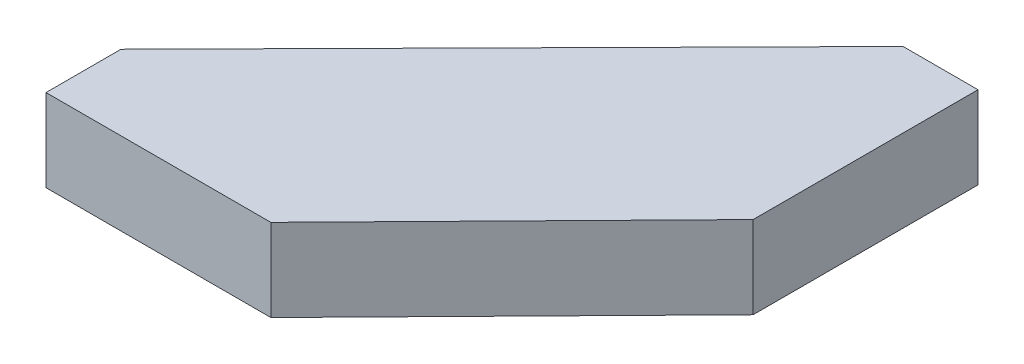
ISO-10303-21;
HEADER;
FILE_DESCRIPTION(('STEP AP214'),'2;1');
FILE_NAME('part.step','',(''),(''),'','','');
FILE_SCHEMA(('AUTOMOTIVE_DESIGN { 1 0 10303 214 1 1 1 1 }'));
ENDSEC;
DATA;
#1=APPLICATION_CONTEXT('core data for automotive mechanical design processes');
#2=APPLICATION_PROTOCOL_DEFINITION('international standard','automotive_design',2000,#1);
#3=PRODUCT_CONTEXT('',#1,'mechanical');
#4=PRODUCT('Part','Part','',(#3));
#5=PRODUCT_RELATED_PRODUCT_CATEGORY('part','',(#4));
#6=PRODUCT_DEFINITION_FORMATION('','',#4);
#7=PRODUCT_DEFINITION_CONTEXT('part definition',#1,'design');
#8=PRODUCT_DEFINITION('design','',#6,#7);
#9=PRODUCT_DEFINITION_SHAPE('','',#8);
#10=(LENGTH_UNIT() NAMED_UNIT(*) SI_UNIT(.MILLI.,.METRE.));
#11=(NAMED_UNIT(*) PLANE_ANGLE_UNIT() SI_UNIT($,.RADIAN.));
#12=(NAMED_UNIT(*) SI_UNIT($,.STERADIAN.) SOLID_ANGLE_UNIT());
#13=UNCERTAINTY_MEASURE_WITH_UNIT(LENGTH_MEASURE(1.E-05),#10,'distance_accuracy_value','');
#14=(GEOMETRIC_REPRESENTATION_CONTEXT(3) GLOBAL_UNCERTAINTY_ASSIGNED_CONTEXT((#13)) GLOBAL_UNIT_ASSIGNED_CONTEXT((#10,
#11,#12)) REPRESENTATION_CONTEXT('',''));
#15=CARTESIAN_POINT('',(0.,0.,0.));
#16=DIRECTION('',(0.,0.,1.));
#17=DIRECTION('',(1.,0.,0.));
#18=AXIS2_PLACEMENT_3D('',#15,#16,#17);
#19=CARTESIAN_POINT('',(-15.4006334841629,4.4,10.3031674208145));
#20=DIRECTION('',(1.,0.,0.));
#21=DIRECTION('',(0.,0.,-1.));
#22=AXIS2_PLACEMENT_3D('',#19,#20,#21);
#23=PLANE('',#22);
#24=DIRECTION('',(0.,0.,1.));
#25=VECTOR('',#24,1.);
#26=CARTESIAN_POINT('',(-15.4006334841629,0.,10.3031674208145));
#27=LINE('',#26,#25);
#28=CARTESIAN_POINT('',(-15.4006334841629,0.,10.3031674208145));
#29=VERTEX_POINT('',#28);
#30=CARTESIAN_POINT('',(-15.4006334841629,0.,14.3031674208145));
#31=VERTEX_POINT('',#30);
#32=EDGE_CURVE('E121',#29,#31,#27,.T.);
#33=ORIENTED_EDGE('',*,*,#32,.T.);
#34=DIRECTION('',(0.,-1.,0.));
#35=VECTOR('',#34,1.);
#36=CARTESIAN_POINT('',(-15.4006334841629,4.4,14.3031674208145));
#37=LINE('',#36,#35);
#38=CARTESIAN_POINT('',(-15.4006334841629,4.4,14.3031674208145));
#39=VERTEX_POINT('',#38);
#40=EDGE_CURVE('E11',#39,#31,#37,.T.);
#41=ORIENTED_EDGE('',*,*,#40,.F.);
#42=DIRECTION('',(0.,0.,1.));
#43=VECTOR('',#42,1.);
#44=CARTESIAN_POINT('',(-15.4006334841629,4.4,10.3031674208145));
#45=LINE('',#44,#43);
#46=CARTESIAN_POINT('',(-15.4006334841629,4.4,10.3031674208145));
#47=VERTEX_POINT('',#46);
#48=EDGE_CURVE('E131',#47,#39,#45,.T.);
#49=ORIENTED_EDGE('',*,*,#48,.F.);
#50=DIRECTION('',(0.,-1.,0.));
#51=VECTOR('',#50,1.);
#52=CARTESIAN_POINT('',(-15.4006334841629,4.4,10.3031674208145));
#53=LINE('',#52,#51);
#54=EDGE_CURVE('E117',#47,#29,#53,.T.);
#55=ORIENTED_EDGE('',*,*,#54,.T.);
#56=EDGE_LOOP('',(#33,#41,#49,#55));
#57=FACE_BOUND('',#56,.T.);
#58=ADVANCED_FACE('F37',(#57),#23,.F.);
#59=CARTESIAN_POINT('',(-15.4006334841629,4.4,14.3031674208145));
#60=DIRECTION('',(0.,0.,-1.));
#61=DIRECTION('',(-1.,0.,0.));
#62=AXIS2_PLACEMENT_3D('',#59,#60,#61);
#63=PLANE('',#62);
#64=DIRECTION('',(1.,0.,0.));
#65=VECTOR('',#64,1.);
#66=CARTESIAN_POINT('',(-15.4006334841629,0.,14.3031674208145));
#67=LINE('',#66,#65);
#68=CARTESIAN_POINT('',(-3.40063348416288,0.,14.3031674208145));
#69=VERTEX_POINT('',#68);
#70=EDGE_CURVE('E124',#31,#69,#67,.T.);
#71=ORIENTED_EDGE('',*,*,#70,.T.);
#72=DIRECTION('',(0.,-1.,0.));
#73=VECTOR('',#72,1.);
#74=CARTESIAN_POINT('',(-3.40063348416288,4.4,14.3031674208145));
#75=LINE('',#74,#73);
#76=CARTESIAN_POINT('',(-3.40063348416288,4.4,14.3031674208145));
#77=VERTEX_POINT('',#76);
#78=EDGE_CURVE('E45',#77,#69,#75,.T.);
#79=ORIENTED_EDGE('',*,*,#78,.F.);
#80=DIRECTION('',(1.,0.,0.));
#81=VECTOR('',#80,1.);
#82=CARTESIAN_POINT('',(-15.4006334841629,4.4,14.3031674208145));
#83=LINE('',#82,#81);
#84=EDGE_CURVE('E90',#39,#77,#83,.T.);
#85=ORIENTED_EDGE('',*,*,#84,.F.);
#86=ORIENTED_EDGE('',*,*,#40,.T.);
#87=EDGE_LOOP('',(#71,#79,#85,#86));
#88=FACE_BOUND('',#87,.T.);
#89=ADVANCED_FACE('F155',(#88),#63,.F.);
#90=CARTESIAN_POINT('',(-3.40063348416288,4.4,14.3031674208145));
#91=DIRECTION('',(-0.714212839142508,0.,-0.699928582359656));
#92=DIRECTION('',(-0.699928582359656,0.,0.714212839142508));
#93=AXIS2_PLACEMENT_3D('',#90,#91,#92);
#94=PLANE('',#93);
#95=DIRECTION('',(0.699928582359656,0.,-0.714212839142508));
#96=VECTOR('',#95,1.);
#97=CARTESIAN_POINT('',(-3.40063348416288,0.,14.3031674208145));
#98=LINE('',#97,#96);
#99=CARTESIAN_POINT('',(9.33936651583711,0.,1.30316742081447));
#100=VERTEX_POINT('',#99);
#101=EDGE_CURVE('E126',#69,#100,#98,.T.);
#102=ORIENTED_EDGE('',*,*,#101,.T.);
#103=DIRECTION('',(0.,-1.,0.));
#104=VECTOR('',#103,1.);
#105=CARTESIAN_POINT('',(9.33936651583711,4.4,1.30316742081447));
#106=LINE('',#105,#104);
#107=CARTESIAN_POINT('',(9.33936651583711,4.4,1.30316742081447));
#108=VERTEX_POINT('',#107);
#109=EDGE_CURVE('E112',#108,#100,#106,.T.);
#110=ORIENTED_EDGE('',*,*,#109,.F.);
#111=DIRECTION('',(0.699928582359656,0.,-0.714212839142508));
#112=VECTOR('',#111,1.);
#113=CARTESIAN_POINT('',(-3.40063348416288,4.4,14.3031674208145));
#114=LINE('',#113,#112);
#115=EDGE_CURVE('E103',#77,#108,#114,.T.);
#116=ORIENTED_EDGE('',*,*,#115,.F.);
#117=ORIENTED_EDGE('',*,*,#78,.T.);
#118=EDGE_LOOP('',(#102,#110,#116,#117));
#119=FACE_BOUND('',#118,.T.);
#120=ADVANCED_FACE('F137',(#119),#94,.F.);
#121=CARTESIAN_POINT('',(9.33936651583711,4.4,1.30316742081447));
#122=DIRECTION('',(-1.,0.,0.));
#123=DIRECTION('',(0.,0.,1.));
#124=AXIS2_PLACEMENT_3D('',#121,#122,#123);
#125=PLANE('',#124);
#126=DIRECTION('',(0.,0.,-1.));
#127=VECTOR('',#126,1.);
#128=CARTESIAN_POINT('',(9.33936651583711,0.,1.30316742081447));
#129=LINE('',#128,#127);
#130=CARTESIAN_POINT('',(9.33936651583713,0.,-10.6968325791855));
#131=VERTEX_POINT('',#130);
#132=EDGE_CURVE('E111',#100,#131,#129,.T.);
#133=ORIENTED_EDGE('',*,*,#132,.T.);
#134=DIRECTION('',(0.,-1.,0.));
#135=VECTOR('',#134,1.);
#136=CARTESIAN_POINT('',(9.33936651583713,4.4,-10.6968325791855));
#137=LINE('',#136,#135);
#138=CARTESIAN_POINT('',(9.33936651583713,4.4,-10.6968325791855));
#139=VERTEX_POINT('',#138);
#140=EDGE_CURVE('E108',#139,#131,#137,.T.);
#141=ORIENTED_EDGE('',*,*,#140,.F.);
#142=DIRECTION('',(0.,0.,-1.));
#143=VECTOR('',#142,1.);
#144=CARTESIAN_POINT('',(9.33936651583711,4.4,1.30316742081447));
#145=LINE('',#144,#143);
#146=EDGE_CURVE('E97',#108,#139,#145,.T.);
#147=ORIENTED_EDGE('',*,*,#146,.F.);
#148=ORIENTED_EDGE('',*,*,#109,.T.);
#149=EDGE_LOOP('',(#133,#141,#147,#148));
#150=FACE_BOUND('',#149,.T.);
#151=ADVANCED_FACE('F109',(#150),#125,.F.);
#152=CARTESIAN_POINT('',(9.33936651583713,4.4,-10.6968325791855));
#153=DIRECTION('',(0.,0.,1.));
#154=DIRECTION('',(1.,0.,0.));
#155=AXIS2_PLACEMENT_3D('',#152,#153,#154);
#156=PLANE('',#155);
#157=DIRECTION('',(-1.,0.,0.));
#158=VECTOR('',#157,1.);
#159=CARTESIAN_POINT('',(9.33936651583713,0.,-10.6968325791855));
#160=LINE('',#159,#158);
#161=CARTESIAN_POINT('',(5.33936651583713,0.,-10.6968325791855));
#162=VERTEX_POINT('',#161);
#163=EDGE_CURVE('E76',#131,#162,#160,.T.);
#164=ORIENTED_EDGE('',*,*,#163,.T.);
#165=DIRECTION('',(0.,-1.,0.));
#166=VECTOR('',#165,1.);
#167=CARTESIAN_POINT('',(5.33936651583713,4.4,-10.6968325791855));
#168=LINE('',#167,#166);
#169=CARTESIAN_POINT('',(5.33936651583713,4.4,-10.6968325791855));
#170=VERTEX_POINT('',#169);
#171=EDGE_CURVE('E113',#170,#162,#168,.T.);
#172=ORIENTED_EDGE('',*,*,#171,.F.);
#173=DIRECTION('',(-1.,0.,0.));
#174=VECTOR('',#173,1.);
#175=CARTESIAN_POINT('',(9.33936651583713,4.4,-10.6968325791855));
#176=LINE('',#175,#174);
#177=EDGE_CURVE('E101',#139,#170,#176,.T.);
#178=ORIENTED_EDGE('',*,*,#177,.F.);
#179=ORIENTED_EDGE('',*,*,#140,.T.);
#180=EDGE_LOOP('',(#164,#172,#178,#179));
#181=FACE_BOUND('',#180,.T.);
#182=ADVANCED_FACE('F115',(#181),#156,.F.);
#183=CARTESIAN_POINT('',(5.33936651583713,4.4,-10.6968325791855));
#184=DIRECTION('',(0.7114975721759,0.,0.702688554615627));
#185=DIRECTION('',(0.702688554615627,0.,-0.7114975721759));
#186=AXIS2_PLACEMENT_3D('',#183,#184,#185);
#187=PLANE('',#186);
#188=DIRECTION('',(-0.702688554615627,0.,0.7114975721759));
#189=VECTOR('',#188,1.);
#190=CARTESIAN_POINT('',(5.33936651583713,0.,-10.6968325791855));
#191=LINE('',#190,#189);
#192=EDGE_CURVE('E82',#162,#29,#191,.T.);
#193=ORIENTED_EDGE('',*,*,#192,.T.);
#194=ORIENTED_EDGE('',*,*,#54,.F.);
#195=DIRECTION('',(-0.702688554615627,0.,0.7114975721759));
#196=VECTOR('',#195,1.);
#197=CARTESIAN_POINT('',(5.33936651583713,4.4,-10.6968325791855));
#198=LINE('',#197,#196);
#199=EDGE_CURVE('E53',#170,#47,#198,.T.);
#200=ORIENTED_EDGE('',*,*,#199,.F.);
#201=ORIENTED_EDGE('',*,*,#171,.T.);
#202=EDGE_LOOP('',(#193,#194,#200,#201));
#203=FACE_BOUND('',#202,.T.);
#204=ADVANCED_FACE('F144',(#203),#187,.F.);
#205=CARTESIAN_POINT('',(0.,4.4,0.));
#206=DIRECTION('',(0.,1.,0.));
#207=DIRECTION('',(0.,0.,1.));
#208=AXIS2_PLACEMENT_3D('',#205,#206,#207);
#209=PLANE('',#208);
#210=ORIENTED_EDGE('',*,*,#48,.T.);
#211=ORIENTED_EDGE('',*,*,#84,.T.);
#212=ORIENTED_EDGE('',*,*,#115,.T.);
#213=ORIENTED_EDGE('',*,*,#146,.T.);
#214=ORIENTED_EDGE('',*,*,#177,.T.);
#215=ORIENTED_EDGE('',*,*,#199,.T.);
#216=EDGE_LOOP('',(#210,#211,#212,#213,#214,#215));
#217=FACE_BOUND('',#216,.T.);
#218=ADVANCED_FACE('F99',(#217),#209,.T.);
#219=CARTESIAN_POINT('',(0.,0.,0.));
#220=DIRECTION('',(0.,1.,0.));
#221=DIRECTION('',(0.,0.,1.));
#222=AXIS2_PLACEMENT_3D('',#219,#220,#221);
#223=PLANE('',#222);
#224=ORIENTED_EDGE('',*,*,#32,.F.);
#225=ORIENTED_EDGE('',*,*,#192,.F.);
#226=ORIENTED_EDGE('',*,*,#163,.F.);
#227=ORIENTED_EDGE('',*,*,#132,.F.);
#228=ORIENTED_EDGE('',*,*,#101,.F.);
#229=ORIENTED_EDGE('',*,*,#70,.F.);
#230=EDGE_LOOP('',(#224,#225,#226,#227,#228,#229));
#231=FACE_BOUND('',#230,.T.);
#232=ADVANCED_FACE('F140',(#231),#223,.F.);
#233=CLOSED_SHELL('',(#58,#89,#120,#151,#182,#204,#218,#232));
#234=MANIFOLD_SOLID_BREP('B2',#233);
#235=ADVANCED_BREP_SHAPE_REPRESENTATION('',(#18,#234),#14);
#236=SHAPE_DEFINITION_REPRESENTATION(#9,#235);
ENDSEC;
END-ISO-10303-21;
